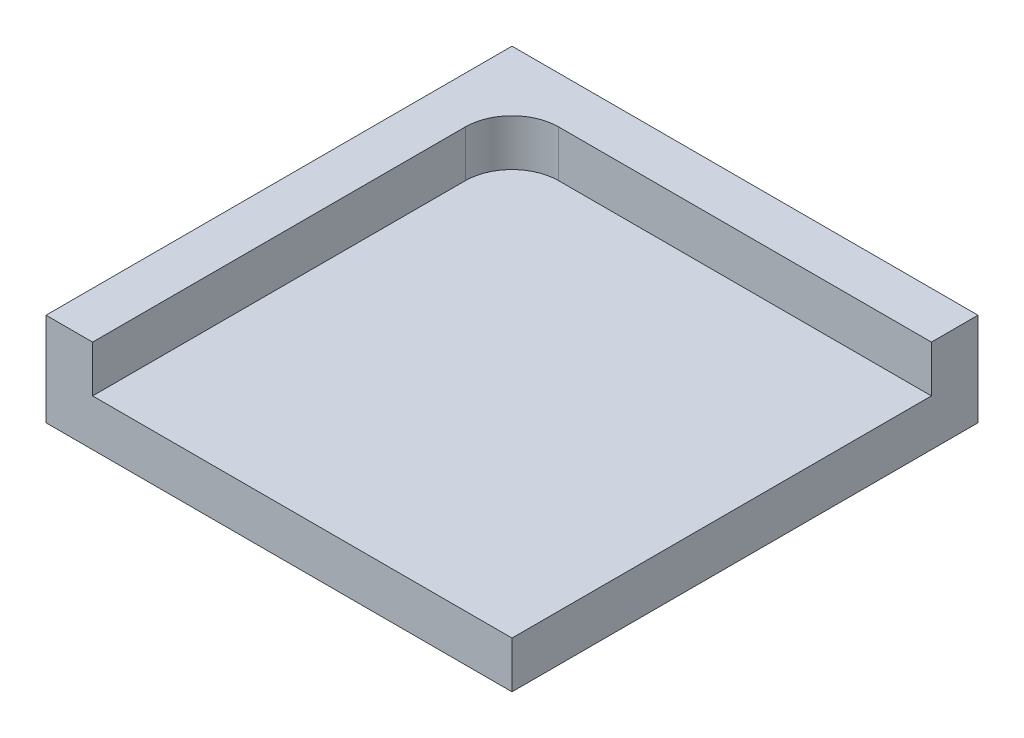
ISO-10303-21;
HEADER;
FILE_DESCRIPTION(('STEP AP214'),'2;1');
FILE_NAME('part.step','',(''),(''),'','','');
FILE_SCHEMA(('AUTOMOTIVE_DESIGN { 1 0 10303 214 1 1 1 1 }'));
ENDSEC;
DATA;
#1=APPLICATION_CONTEXT('core data for automotive mechanical design processes');
#2=APPLICATION_PROTOCOL_DEFINITION('international standard','automotive_design',2000,#1);
#3=PRODUCT_CONTEXT('',#1,'mechanical');
#4=PRODUCT('Part','Part','',(#3));
#5=PRODUCT_RELATED_PRODUCT_CATEGORY('part','',(#4));
#6=PRODUCT_DEFINITION_FORMATION('','',#4);
#7=PRODUCT_DEFINITION_CONTEXT('part definition',#1,'design');
#8=PRODUCT_DEFINITION('design','',#6,#7);
#9=PRODUCT_DEFINITION_SHAPE('','',#8);
#10=(LENGTH_UNIT() NAMED_UNIT(*) SI_UNIT(.MILLI.,.METRE.));
#11=(NAMED_UNIT(*) PLANE_ANGLE_UNIT() SI_UNIT($,.RADIAN.));
#12=(NAMED_UNIT(*) SI_UNIT($,.STERADIAN.) SOLID_ANGLE_UNIT());
#13=UNCERTAINTY_MEASURE_WITH_UNIT(LENGTH_MEASURE(1.E-05),#10,'distance_accuracy_value','');
#14=(GEOMETRIC_REPRESENTATION_CONTEXT(3) GLOBAL_UNCERTAINTY_ASSIGNED_CONTEXT((#13)) GLOBAL_UNIT_ASSIGNED_CONTEXT((#10,
#11,#12)) REPRESENTATION_CONTEXT('',''));
#15=CARTESIAN_POINT('',(0.,0.,0.));
#16=DIRECTION('',(0.,0.,1.));
#17=DIRECTION('',(1.,0.,0.));
#18=AXIS2_PLACEMENT_3D('',#15,#16,#17);
#19=CARTESIAN_POINT('',(0.,0.,0.));
#20=DIRECTION('',(0.,-1.,0.));
#21=DIRECTION('',(0.,0.,-1.));
#22=AXIS2_PLACEMENT_3D('',#19,#20,#21);
#23=PLANE('',#22);
#24=DIRECTION('',(1.,0.,0.));
#25=VECTOR('',#24,1.);
#26=CARTESIAN_POINT('',(-5.99999999999999,0.,-8.));
#27=LINE('',#26,#25);
#28=CARTESIAN_POINT('',(-5.99999999999999,0.,-8.));
#29=VERTEX_POINT('',#28);
#30=CARTESIAN_POINT('',(10.,0.,-8.));
#31=VERTEX_POINT('',#30);
#32=EDGE_CURVE('E146',#29,#31,#27,.T.);
#33=ORIENTED_EDGE('',*,*,#32,.F.);
#34=CARTESIAN_POINT('',(-6.,0.,-6.));
#35=DIRECTION('',(0.,-1.,0.));
#36=DIRECTION('',(0.,0.,-1.));
#37=AXIS2_PLACEMENT_3D('',#34,#35,#36);
#38=CIRCLE('',#37,2.);
#39=CARTESIAN_POINT('',(-8.,0.,-5.99999999999999));
#40=VERTEX_POINT('',#39);
#41=EDGE_CURVE('E149',#40,#29,#38,.T.);
#42=ORIENTED_EDGE('',*,*,#41,.F.);
#43=DIRECTION('',(0.,0.,1.));
#44=VECTOR('',#43,1.);
#45=CARTESIAN_POINT('',(-8.,0.,-5.99999999999999));
#46=LINE('',#45,#44);
#47=CARTESIAN_POINT('',(-8.,0.,10.));
#48=VERTEX_POINT('',#47);
#49=EDGE_CURVE('E151',#40,#48,#46,.T.);
#50=ORIENTED_EDGE('',*,*,#49,.T.);
#51=DIRECTION('',(1.,0.,0.));
#52=VECTOR('',#51,1.);
#53=CARTESIAN_POINT('',(-10.,0.,10.));
#54=LINE('',#53,#52);
#55=CARTESIAN_POINT('',(10.,0.,10.));
#56=VERTEX_POINT('',#55);
#57=EDGE_CURVE('E76',#48,#56,#54,.T.);
#58=ORIENTED_EDGE('',*,*,#57,.T.);
#59=DIRECTION('',(0.,0.,-1.));
#60=VECTOR('',#59,1.);
#61=CARTESIAN_POINT('',(10.,0.,10.));
#62=LINE('',#61,#60);
#63=EDGE_CURVE('E126',#56,#31,#62,.T.);
#64=ORIENTED_EDGE('',*,*,#63,.T.);
#65=EDGE_LOOP('',(#33,#42,#50,#58,#64));
#66=FACE_BOUND('',#65,.T.);
#67=ADVANCED_FACE('F39',(#66),#23,.F.);
#68=CARTESIAN_POINT('',(10.,-2.,10.));
#69=DIRECTION('',(1.,0.,0.));
#70=DIRECTION('',(0.,0.,-1.));
#71=AXIS2_PLACEMENT_3D('',#68,#69,#70);
#72=PLANE('',#71);
#73=ORIENTED_EDGE('',*,*,#63,.F.);
#74=DIRECTION('',(0.,1.,0.));
#75=VECTOR('',#74,1.);
#76=CARTESIAN_POINT('',(10.,-2.,10.));
#77=LINE('',#76,#75);
#78=CARTESIAN_POINT('',(10.,-2.,10.));
#79=VERTEX_POINT('',#78);
#80=EDGE_CURVE('E11',#79,#56,#77,.T.);
#81=ORIENTED_EDGE('',*,*,#80,.F.);
#82=DIRECTION('',(0.,0.,-1.));
#83=VECTOR('',#82,1.);
#84=CARTESIAN_POINT('',(10.,-2.,10.));
#85=LINE('',#84,#83);
#86=CARTESIAN_POINT('',(10.,-2.,-10.));
#87=VERTEX_POINT('',#86);
#88=EDGE_CURVE('E120',#79,#87,#85,.T.);
#89=ORIENTED_EDGE('',*,*,#88,.T.);
#90=DIRECTION('',(0.,1.,0.));
#91=VECTOR('',#90,1.);
#92=CARTESIAN_POINT('',(10.,-2.,-10.));
#93=LINE('',#92,#91);
#94=CARTESIAN_POINT('',(10.,2.,-10.));
#95=VERTEX_POINT('',#94);
#96=EDGE_CURVE('E43',#87,#95,#93,.T.);
#97=ORIENTED_EDGE('',*,*,#96,.T.);
#98=DIRECTION('',(0.,0.,1.));
#99=VECTOR('',#98,1.);
#100=CARTESIAN_POINT('',(10.,2.,-10.));
#101=LINE('',#100,#99);
#102=CARTESIAN_POINT('',(10.,2.,-8.));
#103=VERTEX_POINT('',#102);
#104=EDGE_CURVE('E171',#95,#103,#101,.T.);
#105=ORIENTED_EDGE('',*,*,#104,.T.);
#106=DIRECTION('',(0.,-1.,0.));
#107=VECTOR('',#106,1.);
#108=CARTESIAN_POINT('',(10.,2.,-8.));
#109=LINE('',#108,#107);
#110=EDGE_CURVE('E141',#103,#31,#109,.T.);
#111=ORIENTED_EDGE('',*,*,#110,.T.);
#112=EDGE_LOOP('',(#73,#81,#89,#97,#105,#111));
#113=FACE_BOUND('',#112,.T.);
#114=ADVANCED_FACE('F41',(#113),#72,.T.);
#115=CARTESIAN_POINT('',(-10.,-2.,10.));
#116=DIRECTION('',(0.,0.,1.));
#117=DIRECTION('',(1.,0.,0.));
#118=AXIS2_PLACEMENT_3D('',#115,#116,#117);
#119=PLANE('',#118);
#120=ORIENTED_EDGE('',*,*,#57,.F.);
#121=DIRECTION('',(0.,-1.,0.));
#122=VECTOR('',#121,1.);
#123=CARTESIAN_POINT('',(-8.00000000000001,2.,10.));
#124=LINE('',#123,#122);
#125=CARTESIAN_POINT('',(-8.00000000000001,2.,10.));
#126=VERTEX_POINT('',#125);
#127=EDGE_CURVE('E56',#126,#48,#124,.T.);
#128=ORIENTED_EDGE('',*,*,#127,.F.);
#129=DIRECTION('',(-1.,0.,0.));
#130=VECTOR('',#129,1.);
#131=CARTESIAN_POINT('',(-8.00000000000001,2.,10.));
#132=LINE('',#131,#130);
#133=CARTESIAN_POINT('',(-10.,2.,10.));
#134=VERTEX_POINT('',#133);
#135=EDGE_CURVE('E132',#126,#134,#132,.T.);
#136=ORIENTED_EDGE('',*,*,#135,.T.);
#137=DIRECTION('',(0.,1.,0.));
#138=VECTOR('',#137,1.);
#139=CARTESIAN_POINT('',(-10.,-2.,10.));
#140=LINE('',#139,#138);
#141=CARTESIAN_POINT('',(-10.,-2.,10.));
#142=VERTEX_POINT('',#141);
#143=EDGE_CURVE('E48',#142,#134,#140,.T.);
#144=ORIENTED_EDGE('',*,*,#143,.F.);
#145=DIRECTION('',(1.,0.,0.));
#146=VECTOR('',#145,1.);
#147=CARTESIAN_POINT('',(-10.,-2.,10.));
#148=LINE('',#147,#146);
#149=EDGE_CURVE('E116',#142,#79,#148,.T.);
#150=ORIENTED_EDGE('',*,*,#149,.T.);
#151=ORIENTED_EDGE('',*,*,#80,.T.);
#152=EDGE_LOOP('',(#120,#128,#136,#144,#150,#151));
#153=FACE_BOUND('',#152,.T.);
#154=ADVANCED_FACE('F133',(#153),#119,.T.);
#155=CARTESIAN_POINT('',(-10.,-2.,10.));
#156=DIRECTION('',(-1.,0.,0.));
#157=DIRECTION('',(0.,0.,1.));
#158=AXIS2_PLACEMENT_3D('',#155,#156,#157);
#159=PLANE('',#158);
#160=ORIENTED_EDGE('',*,*,#143,.T.);
#161=DIRECTION('',(0.,0.,-1.));
#162=VECTOR('',#161,1.);
#163=CARTESIAN_POINT('',(-10.,2.,10.));
#164=LINE('',#163,#162);
#165=CARTESIAN_POINT('',(-10.,2.,-10.));
#166=VERTEX_POINT('',#165);
#167=EDGE_CURVE('E110',#134,#166,#164,.T.);
#168=ORIENTED_EDGE('',*,*,#167,.T.);
#169=DIRECTION('',(0.,1.,0.));
#170=VECTOR('',#169,1.);
#171=CARTESIAN_POINT('',(-10.,-2.,-10.));
#172=LINE('',#171,#170);
#173=CARTESIAN_POINT('',(-10.,-2.,-10.));
#174=VERTEX_POINT('',#173);
#175=EDGE_CURVE('E86',#174,#166,#172,.T.);
#176=ORIENTED_EDGE('',*,*,#175,.F.);
#177=DIRECTION('',(0.,0.,1.));
#178=VECTOR('',#177,1.);
#179=CARTESIAN_POINT('',(-10.,-2.,10.));
#180=LINE('',#179,#178);
#181=EDGE_CURVE('E107',#174,#142,#180,.T.);
#182=ORIENTED_EDGE('',*,*,#181,.T.);
#183=EDGE_LOOP('',(#160,#168,#176,#182));
#184=FACE_BOUND('',#183,.T.);
#185=ADVANCED_FACE('F106',(#184),#159,.T.);
#186=CARTESIAN_POINT('',(-10.,-2.,-10.));
#187=DIRECTION('',(0.,0.,-1.));
#188=DIRECTION('',(-1.,0.,0.));
#189=AXIS2_PLACEMENT_3D('',#186,#187,#188);
#190=PLANE('',#189);
#191=ORIENTED_EDGE('',*,*,#175,.T.);
#192=DIRECTION('',(1.,0.,0.));
#193=VECTOR('',#192,1.);
#194=CARTESIAN_POINT('',(-10.,2.,-10.));
#195=LINE('',#194,#193);
#196=EDGE_CURVE('E140',#166,#95,#195,.T.);
#197=ORIENTED_EDGE('',*,*,#196,.T.);
#198=ORIENTED_EDGE('',*,*,#96,.F.);
#199=DIRECTION('',(-1.,0.,0.));
#200=VECTOR('',#199,1.);
#201=CARTESIAN_POINT('',(-10.,-2.,-10.));
#202=LINE('',#201,#200);
#203=EDGE_CURVE('E114',#87,#174,#202,.T.);
#204=ORIENTED_EDGE('',*,*,#203,.T.);
#205=EDGE_LOOP('',(#191,#197,#198,#204));
#206=FACE_BOUND('',#205,.T.);
#207=ADVANCED_FACE('F118',(#206),#190,.T.);
#208=CARTESIAN_POINT('',(0.,-2.,0.));
#209=DIRECTION('',(0.,-1.,0.));
#210=DIRECTION('',(0.,0.,-1.));
#211=AXIS2_PLACEMENT_3D('',#208,#209,#210);
#212=PLANE('',#211);
#213=ORIENTED_EDGE('',*,*,#88,.F.);
#214=ORIENTED_EDGE('',*,*,#149,.F.);
#215=ORIENTED_EDGE('',*,*,#181,.F.);
#216=ORIENTED_EDGE('',*,*,#203,.F.);
#217=EDGE_LOOP('',(#213,#214,#215,#216));
#218=FACE_BOUND('',#217,.T.);
#219=ADVANCED_FACE('F113',(#218),#212,.T.);
#220=CARTESIAN_POINT('',(-8.,2.,-5.99999999999999));
#221=DIRECTION('',(1.,0.,0.));
#222=DIRECTION('',(0.,0.,-1.));
#223=AXIS2_PLACEMENT_3D('',#220,#221,#222);
#224=PLANE('',#223);
#225=ORIENTED_EDGE('',*,*,#49,.F.);
#226=DIRECTION('',(0.,-1.,0.));
#227=VECTOR('',#226,1.);
#228=CARTESIAN_POINT('',(-8.,2.,-5.99999999999999));
#229=LINE('',#228,#227);
#230=CARTESIAN_POINT('',(-8.,2.,-5.99999999999999));
#231=VERTEX_POINT('',#230);
#232=EDGE_CURVE('E154',#231,#40,#229,.T.);
#233=ORIENTED_EDGE('',*,*,#232,.F.);
#234=DIRECTION('',(0.,0.,1.));
#235=VECTOR('',#234,1.);
#236=CARTESIAN_POINT('',(-8.,2.,-5.99999999999999));
#237=LINE('',#236,#235);
#238=EDGE_CURVE('E136',#231,#126,#237,.T.);
#239=ORIENTED_EDGE('',*,*,#238,.T.);
#240=ORIENTED_EDGE('',*,*,#127,.T.);
#241=EDGE_LOOP('',(#225,#233,#239,#240));
#242=FACE_BOUND('',#241,.T.);
#243=ADVANCED_FACE('F179',(#242),#224,.T.);
#244=CARTESIAN_POINT('',(-6.,2.,-6.));
#245=DIRECTION('',(0.,-1.,0.));
#246=DIRECTION('',(0.,0.,-1.));
#247=AXIS2_PLACEMENT_3D('',#244,#245,#246);
#248=CYLINDRICAL_SURFACE('',#247,2.);
#249=ORIENTED_EDGE('',*,*,#41,.T.);
#250=DIRECTION('',(0.,-1.,0.));
#251=VECTOR('',#250,1.);
#252=CARTESIAN_POINT('',(-5.99999999999999,2.,-8.));
#253=LINE('',#252,#251);
#254=CARTESIAN_POINT('',(-5.99999999999999,2.,-8.));
#255=VERTEX_POINT('',#254);
#256=EDGE_CURVE('E143',#255,#29,#253,.T.);
#257=ORIENTED_EDGE('',*,*,#256,.F.);
#258=CARTESIAN_POINT('',(-6.,2.,-6.));
#259=DIRECTION('',(0.,-1.,0.));
#260=DIRECTION('',(0.,0.,-1.));
#261=AXIS2_PLACEMENT_3D('',#258,#259,#260);
#262=CIRCLE('',#261,2.);
#263=EDGE_CURVE('E180',#231,#255,#262,.T.);
#264=ORIENTED_EDGE('',*,*,#263,.F.);
#265=ORIENTED_EDGE('',*,*,#232,.T.);
#266=EDGE_LOOP('',(#249,#257,#264,#265));
#267=FACE_BOUND('',#266,.T.);
#268=ADVANCED_FACE('F181',(#267),#248,.F.);
#269=CARTESIAN_POINT('',(-5.99999999999999,2.,-8.));
#270=DIRECTION('',(0.,0.,-1.));
#271=DIRECTION('',(-1.,0.,0.));
#272=AXIS2_PLACEMENT_3D('',#269,#270,#271);
#273=PLANE('',#272);
#274=ORIENTED_EDGE('',*,*,#32,.T.);
#275=ORIENTED_EDGE('',*,*,#110,.F.);
#276=DIRECTION('',(1.,0.,0.));
#277=VECTOR('',#276,1.);
#278=CARTESIAN_POINT('',(-5.99999999999999,2.,-8.));
#279=LINE('',#278,#277);
#280=EDGE_CURVE('E165',#255,#103,#279,.T.);
#281=ORIENTED_EDGE('',*,*,#280,.F.);
#282=ORIENTED_EDGE('',*,*,#256,.T.);
#283=EDGE_LOOP('',(#274,#275,#281,#282));
#284=FACE_BOUND('',#283,.T.);
#285=ADVANCED_FACE('F161',(#284),#273,.F.);
#286=CARTESIAN_POINT('',(-6.,2.,-6.));
#287=DIRECTION('',(0.,-1.,0.));
#288=DIRECTION('',(0.,0.,-1.));
#289=AXIS2_PLACEMENT_3D('',#286,#287,#288);
#290=PLANE('',#289);
#291=ORIENTED_EDGE('',*,*,#196,.F.);
#292=ORIENTED_EDGE('',*,*,#167,.F.);
#293=ORIENTED_EDGE('',*,*,#135,.F.);
#294=ORIENTED_EDGE('',*,*,#238,.F.);
#295=ORIENTED_EDGE('',*,*,#263,.T.);
#296=ORIENTED_EDGE('',*,*,#280,.T.);
#297=ORIENTED_EDGE('',*,*,#104,.F.);
#298=EDGE_LOOP('',(#291,#292,#293,#294,#295,#296,#297));
#299=FACE_BOUND('',#298,.T.);
#300=ADVANCED_FACE('F138',(#299),#290,.F.);
#301=CLOSED_SHELL('',(#67,#114,#154,#185,#207,#219,#243,#268,#285,#300));
#302=MANIFOLD_SOLID_BREP('B2',#301);
#303=ADVANCED_BREP_SHAPE_REPRESENTATION('',(#18,#302),#14);
#304=SHAPE_DEFINITION_REPRESENTATION(#9,#303);
ENDSEC;
END-ISO-10303-21;
